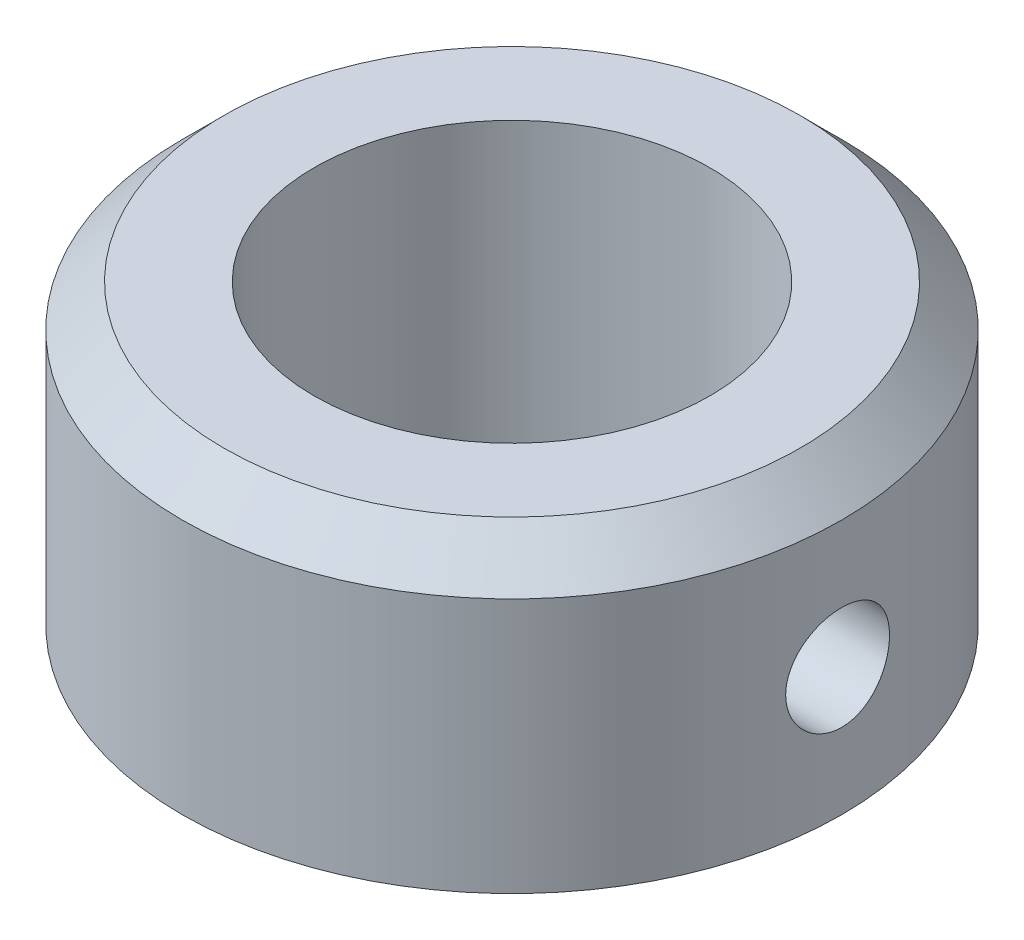
ISO-10303-21;
HEADER;
FILE_DESCRIPTION(('STEP AP214'),'2;1');
FILE_NAME('part.step','',(''),(''),'','','');
FILE_SCHEMA(('AUTOMOTIVE_DESIGN { 1 0 10303 214 1 1 1 1 }'));
ENDSEC;
DATA;
#1=APPLICATION_CONTEXT('core data for automotive mechanical design processes');
#2=APPLICATION_PROTOCOL_DEFINITION('international standard','automotive_design',2000,#1);
#3=PRODUCT_CONTEXT('',#1,'mechanical');
#4=PRODUCT('Part','Part','',(#3));
#5=PRODUCT_RELATED_PRODUCT_CATEGORY('part','',(#4));
#6=PRODUCT_DEFINITION_FORMATION('','',#4);
#7=PRODUCT_DEFINITION_CONTEXT('part definition',#1,'design');
#8=PRODUCT_DEFINITION('design','',#6,#7);
#9=PRODUCT_DEFINITION_SHAPE('','',#8);
#10=(LENGTH_UNIT() NAMED_UNIT(*) SI_UNIT(.MILLI.,.METRE.));
#11=(NAMED_UNIT(*) PLANE_ANGLE_UNIT() SI_UNIT($,.RADIAN.));
#12=(NAMED_UNIT(*) SI_UNIT($,.STERADIAN.) SOLID_ANGLE_UNIT());
#13=UNCERTAINTY_MEASURE_WITH_UNIT(LENGTH_MEASURE(1.E-05),#10,'distance_accuracy_value','');
#14=(GEOMETRIC_REPRESENTATION_CONTEXT(3) GLOBAL_UNCERTAINTY_ASSIGNED_CONTEXT((#13)) GLOBAL_UNIT_ASSIGNED_CONTEXT((#10,
#11,#12)) REPRESENTATION_CONTEXT('',''));
#15=CARTESIAN_POINT('',(0.,0.,0.));
#16=DIRECTION('',(0.,0.,1.));
#17=DIRECTION('',(1.,0.,0.));
#18=AXIS2_PLACEMENT_3D('',#15,#16,#17);
#19=CARTESIAN_POINT('',(0.,14.2875,0.));
#20=DIRECTION('',(0.,-1.,0.));
#21=DIRECTION('',(0.,0.,-1.));
#22=AXIS2_PLACEMENT_3D('',#19,#20,#21);
#23=CYLINDRICAL_SURFACE('',#22,15.875);
#24=CARTESIAN_POINT('',(0.,0.,0.));
#25=DIRECTION('',(0.,1.,0.));
#26=DIRECTION('',(0.,0.,1.));
#27=AXIS2_PLACEMENT_3D('',#24,#25,#26);
#28=CIRCLE('',#27,15.875);
#29=CARTESIAN_POINT('',(0.,0.,15.875));
#30=VERTEX_POINT('',#29);
#31=EDGE_CURVE('E49',#30,#30,#28,.T.);
#32=ORIENTED_EDGE('',*,*,#31,.T.);
#33=EDGE_LOOP('',(#32));
#34=FACE_BOUND('',#33,.T.);
#35=CARTESIAN_POINT('',(0.,12.2875,0.));
#36=DIRECTION('',(0.,1.,0.));
#37=DIRECTION('',(0.,0.,1.));
#38=AXIS2_PLACEMENT_3D('',#35,#36,#37);
#39=CIRCLE('',#38,15.875);
#40=CARTESIAN_POINT('',(0.,12.2875,15.875));
#41=VERTEX_POINT('',#40);
#42=EDGE_CURVE('E11',#41,#41,#39,.F.);
#43=ORIENTED_EDGE('',*,*,#42,.T.);
#44=EDGE_LOOP('',(#43));
#45=FACE_BOUND('',#44,.T.);
#46=CARTESIAN_POINT('',(15.875,3.64374999999999,0.));
#47=CARTESIAN_POINT('',(15.8749976905285,3.64375568619766,-0.139500830185539));
#48=CARTESIAN_POINT('',(15.8731419947801,3.65546571914622,-0.27908051086493));
#49=CARTESIAN_POINT('',(15.8659178948552,3.70198127543063,-0.554332602169205));
#50=CARTESIAN_POINT('',(15.8605461533575,3.73680874155772,-0.690001172630402));
#51=CARTESIAN_POINT('',(15.8468931231182,3.8284878014384,-0.953408250254179));
#52=CARTESIAN_POINT('',(15.838614113172,3.88532214917516,-1.08115287640878));
#53=CARTESIAN_POINT('',(15.8200593959887,4.01935816896407,-1.32527427507236));
#54=CARTESIAN_POINT('',(15.8097839446581,4.0965572310916,-1.44165250167252));
#55=CARTESIAN_POINT('',(15.7882789181249,4.26983619062099,-1.66075371320891));
#56=CARTESIAN_POINT('',(15.7770426276349,4.36605639917065,-1.76336508403649));
#57=CARTESIAN_POINT('',(15.7549343730742,4.57434432602156,-1.95105633049785));
#58=CARTESIAN_POINT('',(15.7440624308607,4.68641299297455,-2.03613515592474));
#59=CARTESIAN_POINT('',(15.7238487495485,4.92397396997373,-2.18678638582598));
#60=CARTESIAN_POINT('',(15.7145156893653,5.04953623139938,-2.25224975018839));
#61=CARTESIAN_POINT('',(15.6985288603171,5.31004575806093,-2.36111476445918));
#62=CARTESIAN_POINT('',(15.6918749302862,5.44499245819325,-2.40451774147437));
#63=CARTESIAN_POINT('',(15.6820661459361,5.71926219228117,-2.46768106832768));
#64=CARTESIAN_POINT('',(15.6788829200043,5.85854002018507,-2.48763322567596));
#65=CARTESIAN_POINT('',(15.6762899681021,6.13850035775269,-2.50392296535857));
#66=CARTESIAN_POINT('',(15.6768800035713,6.27918277805104,-2.50026204060486));
#67=CARTESIAN_POINT('',(15.6817409808078,6.55659768988391,-2.46958605918015));
#68=CARTESIAN_POINT('',(15.6859781251668,6.69335457016474,-2.44278542892775));
#69=CARTESIAN_POINT('',(15.6976030586647,6.96040597994823,-2.36692683994249));
#70=CARTESIAN_POINT('',(15.7049909452313,7.09070030947596,-2.3178681929413));
#71=CARTESIAN_POINT('',(15.7221219088789,7.34177586868773,-2.19866560666104));
#72=CARTESIAN_POINT('',(15.7318750083601,7.46251363585546,-2.1284316220382));
#73=CARTESIAN_POINT('',(15.7526303533456,7.69057144600376,-1.96893608650968));
#74=CARTESIAN_POINT('',(15.7636326890424,7.79789051900474,-1.87967316134396));
#75=CARTESIAN_POINT('',(15.7857957932742,7.99730661872632,-1.68348037331111));
#76=CARTESIAN_POINT('',(15.7969569697721,8.08922248190791,-1.57636631847325));
#77=CARTESIAN_POINT('',(15.8180675813961,8.25380182007237,-1.34813750885387));
#78=CARTESIAN_POINT('',(15.8280170101873,8.32646519440781,-1.22702268088441));
#79=CARTESIAN_POINT('',(15.8455950668554,8.45048934185267,-0.974067497564928));
#80=CARTESIAN_POINT('',(15.8532220747265,8.50183525398975,-0.842219736330852));
#81=CARTESIAN_POINT('',(15.8652826395636,8.58160483169139,-0.571625621220902));
#82=CARTESIAN_POINT('',(15.8697164347249,8.61003020701512,-0.432879782727474));
#83=CARTESIAN_POINT('',(15.8748592486748,8.64290887563517,-0.153990644078612));
#84=CARTESIAN_POINT('',(15.8756069401627,8.64761107255733,-0.0138773750128064));
#85=CARTESIAN_POINT('',(15.8733988569315,8.63357184728466,0.265135999056329));
#86=CARTESIAN_POINT('',(15.8704432089591,8.61483122741859,0.404036145414867));
#87=CARTESIAN_POINT('',(15.861184470036,8.55464534978266,0.675919980113211));
#88=CARTESIAN_POINT('',(15.8548993895314,8.51332221365492,0.808931368155592));
#89=CARTESIAN_POINT('',(15.8396839683055,8.40927371003808,1.06613817146967));
#90=CARTESIAN_POINT('',(15.8307534925415,8.34654724992335,1.19033313627767));
#91=CARTESIAN_POINT('',(15.8111428817046,8.20089479134012,1.42747033732642));
#92=CARTESIAN_POINT('',(15.8004493830625,8.1178119535511,1.5403151151242));
#93=CARTESIAN_POINT('',(15.7785422557241,7.93402237169006,1.75054907048365));
#94=CARTESIAN_POINT('',(15.7673285935611,7.8333144924916,1.84793725180501));
#95=CARTESIAN_POINT('',(15.7455212987284,7.61602182136812,2.02540661809191));
#96=CARTESIAN_POINT('',(15.7349343180859,7.49929950898468,2.1053203673828));
#97=CARTESIAN_POINT('',(15.7156996825081,7.25394156017173,2.24440617344564));
#98=CARTESIAN_POINT('',(15.7070519710765,7.12530627095504,2.3035788344921));
#99=CARTESIAN_POINT('',(15.692723937201,6.86025953567076,2.39924721152534));
#100=CARTESIAN_POINT('',(15.6870323710349,6.72387977575668,2.43582895415268));
#101=CARTESIAN_POINT('',(15.6792318846374,6.44681516890138,2.48554958140439));
#102=CARTESIAN_POINT('',(15.6771226893067,6.3061306533778,2.49869026612996));
#103=CARTESIAN_POINT('',(15.676736726904,6.0261202257018,2.50110970594388));
#104=CARTESIAN_POINT('',(15.6784176584198,5.88679657673935,2.4906518422088));
#105=CARTESIAN_POINT('',(15.6853302792804,5.61191659438835,2.4467376845153));
#106=CARTESIAN_POINT('',(15.690561960518,5.47636025239893,2.41328144306746));
#107=CARTESIAN_POINT('',(15.7039712491697,5.2129484462654,2.32441679309038));
#108=CARTESIAN_POINT('',(15.7121461345813,5.08508599358907,2.26902866340948));
#109=CARTESIAN_POINT('',(15.7305237299556,4.8404258214591,2.13789904354915));
#110=CARTESIAN_POINT('',(15.7407265226245,4.72362855357558,2.06215672319887));
#111=CARTESIAN_POINT('',(15.7621455234337,4.50307924052417,1.89151919110473));
#112=CARTESIAN_POINT('',(15.7733713279086,4.39947860811159,1.79642945775363));
#113=CARTESIAN_POINT('',(15.7954929431067,4.20961258205631,1.59020731461215));
#114=CARTESIAN_POINT('',(15.8063886767938,4.12335120919593,1.47907119408493));
#115=CARTESIAN_POINT('',(15.8266990047721,3.97013678634375,1.24310883334057));
#116=CARTESIAN_POINT('',(15.8361041509665,3.90330482424304,1.11820315980724));
#117=CARTESIAN_POINT('',(15.852281357129,3.79167124789795,0.858846165525345));
#118=CARTESIAN_POINT('',(15.8590560972272,3.74684719732645,0.724404726913459));
#119=CARTESIAN_POINT('',(15.8676922722872,3.6904796876912,0.49116214316524));
#120=CARTESIAN_POINT('',(15.8704183473439,3.67298339075226,0.393788645173249));
#121=CARTESIAN_POINT('',(15.8740730163387,3.64961661643718,0.197623276756319));
#122=CARTESIAN_POINT('',(15.8750016361792,3.64374597152913,0.0988314267912595));
#123=CARTESIAN_POINT('',(15.875,3.64374999999999,0.));
#124=B_SPLINE_CURVE_WITH_KNOTS('',3,(#46,#47,#48,#49,#50,#51,#52,#53,#54,#55,#56,#57,#58,#59,
#60,#61,#62,#63,#64,#65,#66,#67,#68,#69,#70,#71,#72,#73,#74,#75,#76,#77,#78,#79,#80,#81,#82,#83,
#84,#85,#86,#87,#88,#89,#90,#91,#92,#93,#94,#95,#96,#97,#98,#99,#100,#101,#102,#103,#104,#105,
#106,#107,#108,#109,#110,#111,#112,#113,#114,#115,#116,#117,#118,#119,#120,#121,#122,#123),
.UNSPECIFIED.,.T.,.F.,(4,2,2,2,2,2,2,2,2,2,2,2,2,2,2,2,2,2,2,2,2,2,2,2,2,2,2,2,2,2,2,2,2,2,2,2,
2,2,4),(0.,0.418141299505619,0.836680062378933,1.25489149284709,1.67304935170822,
2.09441534800902,2.51580657697912,2.9394985756162,3.36316508281016,3.78334170110814,
4.20349175444764,4.61978972807952,5.03610057546584,5.45420731538406,5.8723442609858,
6.29509819735069,6.71785434372836,7.14090471184343,7.56392351956437,7.98249464572574,
8.40105144671147,8.81736685958792,9.23370352827303,9.65335478855145,10.0730330860802,
10.4965717289606,10.9200980313658,11.3420014287822,11.763872425719,12.1810582772812,
12.5982431763157,13.0150432317042,13.4318602893795,13.8530958778462,14.2744290337812,
14.6983343361412,15.1218065792834,15.418049237561,15.7142876267916),.UNSPECIFIED.);
#125=CARTESIAN_POINT('',(15.875,3.64374999999999,0.));
#126=VERTEX_POINT('',#125);
#127=EDGE_CURVE('E58',#126,#126,#124,.T.);
#128=ORIENTED_EDGE('',*,*,#127,.F.);
#129=EDGE_LOOP('',(#128));
#130=FACE_BOUND('',#129,.T.);
#131=ADVANCED_FACE('F32',(#34,#45,#130),#23,.T.);
#132=CARTESIAN_POINT('',(0.,14.2875,0.));
#133=DIRECTION('',(0.,-1.,0.));
#134=DIRECTION('',(0.,0.,-1.));
#135=AXIS2_PLACEMENT_3D('',#132,#133,#134);
#136=CYLINDRICAL_SURFACE('',#135,9.525);
#137=CARTESIAN_POINT('',(0.,0.,0.));
#138=DIRECTION('',(0.,1.,0.));
#139=DIRECTION('',(0.,0.,1.));
#140=AXIS2_PLACEMENT_3D('',#137,#138,#139);
#141=CIRCLE('',#140,9.525);
#142=CARTESIAN_POINT('',(0.,0.,9.525));
#143=VERTEX_POINT('',#142);
#144=EDGE_CURVE('E55',#143,#143,#141,.T.);
#145=ORIENTED_EDGE('',*,*,#144,.F.);
#146=EDGE_LOOP('',(#145));
#147=FACE_BOUND('',#146,.T.);
#148=CARTESIAN_POINT('',(0.,14.2875,0.));
#149=DIRECTION('',(0.,1.,0.));
#150=DIRECTION('',(0.,0.,1.));
#151=AXIS2_PLACEMENT_3D('',#148,#149,#150);
#152=CIRCLE('',#151,9.525);
#153=CARTESIAN_POINT('',(0.,14.2875,9.525));
#154=VERTEX_POINT('',#153);
#155=EDGE_CURVE('E54',#154,#154,#152,.T.);
#156=ORIENTED_EDGE('',*,*,#155,.T.);
#157=EDGE_LOOP('',(#156));
#158=FACE_BOUND('',#157,.T.);
#159=CARTESIAN_POINT('',(9.19106223458421,6.14374999999999,2.5));
#160=CARTESIAN_POINT('',(9.19106469671783,6.00594461933303,2.49999651630335));
#161=CARTESIAN_POINT('',(9.19419536524864,5.86810195062341,2.48856698911158));
#162=CARTESIAN_POINT('',(9.20634374047816,5.59639171921487,2.44323395975473));
#163=CARTESIAN_POINT('',(9.21536452143121,5.4625262705328,2.40931872137328));
#164=CARTESIAN_POINT('',(9.2382026550406,5.2027402318986,2.32020118152029));
#165=CARTESIAN_POINT('',(9.25201340372133,5.07680898400162,2.26502817678528));
#166=CARTESIAN_POINT('',(9.28286698075181,4.83597190264158,2.13505240585555));
#167=CARTESIAN_POINT('',(9.29991003121361,4.72106682767478,2.06024829054647));
#168=CARTESIAN_POINT('',(9.33577063144502,4.50275891310907,1.89119561005043));
#169=CARTESIAN_POINT('',(9.3546188535647,4.39966283821349,1.79655732671428));
#170=CARTESIAN_POINT('',(9.3917009954108,4.21060887398004,1.59136122600481));
#171=CARTESIAN_POINT('',(9.40993485294923,4.12465271529567,1.4808018029795));
#172=CARTESIAN_POINT('',(9.44407532289643,3.97104557772516,1.24478124331787));
#173=CARTESIAN_POINT('',(9.45994152894907,3.90369864204288,1.11911587703889));
#174=CARTESIAN_POINT('',(9.48720758730729,3.79120300590704,0.857760542880182));
#175=CARTESIAN_POINT('',(9.49860816828216,3.74605068358582,0.722072214775204));
#176=CARTESIAN_POINT('',(9.51544156977354,3.68021617052461,0.447723648627483));
#177=CARTESIAN_POINT('',(9.52100140611609,3.6590123778821,0.309196507162028));
#178=CARTESIAN_POINT('',(9.52597058957104,3.64003674009341,0.0304471293071426));
#179=CARTESIAN_POINT('',(9.52538093515139,3.64226109101489,-0.109774828209029));
#180=CARTESIAN_POINT('',(9.51821102208942,3.66970926613428,-0.384306232903464));
#181=CARTESIAN_POINT('',(9.51177751894229,3.69436968175229,-0.518676426459475));
#182=CARTESIAN_POINT('',(9.49381536195328,3.76508094490616,-0.781300207566575));
#183=CARTESIAN_POINT('',(9.48228642225872,3.81113299251447,-0.909553451511083));
#184=CARTESIAN_POINT('',(9.45520936119211,3.92375824014636,-1.15775281714907));
#185=CARTESIAN_POINT('',(9.43962329369205,3.99052639410935,-1.27760616489887));
#186=CARTESIAN_POINT('',(9.40611425532938,4.14253937737374,-1.50460091650506));
#187=CARTESIAN_POINT('',(9.38819084162893,4.2277877099954,-1.61173990411027));
#188=CARTESIAN_POINT('',(9.35132281482883,4.41733965210153,-1.81362691900899));
#189=CARTESIAN_POINT('',(9.33236368507222,4.52213491604779,-1.90791120855082));
#190=CARTESIAN_POINT('',(9.2960441466663,4.74624628227541,-2.07767804040785));
#191=CARTESIAN_POINT('',(9.27868382934781,4.86556321319218,-2.15315950904694));
#192=CARTESIAN_POINT('',(9.24747084091809,5.1163116938337,-2.28351644622864));
#193=CARTESIAN_POINT('',(9.23363914174682,5.24780962061492,-2.33826960831188));
#194=CARTESIAN_POINT('',(9.21131205881438,5.51859710655732,-2.42474154648091));
#195=CARTESIAN_POINT('',(9.20281539912948,5.6578847940405,-2.45646583041804));
#196=CARTESIAN_POINT('',(9.19239121862609,5.93597029004676,-2.49518779718754));
#197=CARTESIAN_POINT('',(9.19028039169482,6.07466523057456,-2.50287567086191));
#198=CARTESIAN_POINT('',(9.19236601037381,6.35135821287837,-2.49520508643));
#199=CARTESIAN_POINT('',(9.19656180844587,6.4893563247422,-2.47984899438321));
#200=CARTESIAN_POINT('',(9.21061121366575,6.75810409889309,-2.42713401203908));
#201=CARTESIAN_POINT('',(9.22035891930024,6.88894055229572,-2.39018663716803));
#202=CARTESIAN_POINT('',(9.24431111095941,7.14256039624038,-2.29579892544996));
#203=CARTESIAN_POINT('',(9.25851616537598,7.26534275732567,-2.23835597492143));
#204=CARTESIAN_POINT('',(9.2901612358676,7.50226617550612,-2.10319536668792));
#205=CARTESIAN_POINT('',(9.30766391896881,7.61616637440571,-2.0250705152844));
#206=CARTESIAN_POINT('',(9.34378308974656,7.82949377411581,-1.85127112066926));
#207=CARTESIAN_POINT('',(9.36239977959191,7.92891833659428,-1.75559338542987));
#208=CARTESIAN_POINT('',(9.39927786841089,8.11331937337981,-1.54621811097832));
#209=CARTESIAN_POINT('',(9.41751487521746,8.19781552315954,-1.43209240369362));
#210=CARTESIAN_POINT('',(9.45104474641045,8.34644876314126,-1.1908749638829));
#211=CARTESIAN_POINT('',(9.46633776713962,8.41058693458745,-1.06378392044015));
#212=CARTESIAN_POINT('',(9.49215832795568,8.51610201903841,-0.801136204232729));
#213=CARTESIAN_POINT('',(9.50272107587817,8.55764760505374,-0.665650921019941));
#214=CARTESIAN_POINT('',(9.51804571346392,8.61729234308272,-0.38930441335033));
#215=CARTESIAN_POINT('',(9.52280884552231,8.6353965167742,-0.248444346951342));
#216=CARTESIAN_POINT('',(9.52594095151323,8.64733812723273,0.0301595122355567));
#217=CARTESIAN_POINT('',(9.52449586601004,8.64188121056917,0.167871404466952));
#218=CARTESIAN_POINT('',(9.51579230125348,8.60848827109106,0.44034443559206));
#219=CARTESIAN_POINT('',(9.50853402822096,8.58055304568667,0.575105678984813));
#220=CARTESIAN_POINT('',(9.48905447985021,8.50339035920003,0.837031488405952));
#221=CARTESIAN_POINT('',(9.47686567932714,8.45430208670446,0.964239633541226));
#222=CARTESIAN_POINT('',(9.4488018447247,8.33635138880815,1.20868668315976));
#223=CARTESIAN_POINT('',(9.43292630649389,8.26748625867049,1.32592422119111));
#224=CARTESIAN_POINT('',(9.39867611913775,8.10984907998123,1.55040317248687));
#225=CARTESIAN_POINT('',(9.38024725825729,8.02060632884076,1.65730575368075));
#226=CARTESIAN_POINT('',(9.34319295861769,7.82564535475627,1.85485689302006));
#227=CARTESIAN_POINT('',(9.32456746989626,7.71992284562675,1.94550120935968));
#228=CARTESIAN_POINT('',(9.28877718764883,7.49231715162915,2.10985382999903));
#229=CARTESIAN_POINT('',(9.27165154261029,7.37013986007461,2.18316410006038));
#230=CARTESIAN_POINT('',(9.24134569862471,7.11476017796992,2.30809776105784));
#231=CARTESIAN_POINT('',(9.22816284486072,6.98156528344162,2.35973575417369));
#232=CARTESIAN_POINT('',(9.20912537607401,6.73128568440578,2.43285817581199));
#233=CARTESIAN_POINT('',(9.20240549628642,6.61531618602453,2.4579783582096));
#234=CARTESIAN_POINT('',(9.19337310015429,6.38082347563426,2.4915498850249));
#235=CARTESIAN_POINT('',(9.19106011647199,6.2623005357581,2.50000299693744));
#236=CARTESIAN_POINT('',(9.19106223458421,6.14374999999999,2.5));
#237=B_SPLINE_CURVE_WITH_KNOTS('',3,(#159,#160,#161,#162,#163,#164,#165,#166,#167,#168,#169,
#170,#171,#172,#173,#174,#175,#176,#177,#178,#179,#180,#181,#182,#183,#184,#185,#186,#187,#188,
#189,#190,#191,#192,#193,#194,#195,#196,#197,#198,#199,#200,#201,#202,#203,#204,#205,#206,#207,
#208,#209,#210,#211,#212,#213,#214,#215,#216,#217,#218,#219,#220,#221,#222,#223,#224,#225,#226,
#227,#228,#229,#230,#231,#232,#233,#234,#235,#236),.UNSPECIFIED.,.T.,.F.,(4,2,2,2,2,2,2,2,2,2,2,
2,2,2,2,2,2,2,2,2,2,2,2,2,2,2,2,2,2,2,2,2,2,2,2,2,2,2,4),(0.,0.412980364300905,
0.826176449889437,1.23880510778357,1.6514621303029,2.07315025475375,2.49488093640762,
2.92314164454474,3.3513324429721,3.77000562874106,4.18861083729642,4.59698582695746,
5.00538372925883,5.417747914411,5.83019034064113,6.25490912606284,6.67965215816201,
7.10686369143113,7.53397301418161,7.94869990764462,8.36338422157175,8.77041142636264,
9.17749055552712,9.59327253122648,10.0091301928111,10.436586743212,10.8640205869238,
11.2882178596807,11.7123242447968,12.1238183210893,12.5352978004165,12.9441100967508,
13.3529783300157,13.7724690121704,14.1920689813797,14.6205291513118,15.0487001713948,
15.4040145720673,15.7592912906431),.UNSPECIFIED.);
#238=CARTESIAN_POINT('',(9.19106223458421,6.14374999999999,2.5));
#239=VERTEX_POINT('',#238);
#240=EDGE_CURVE('E36',#239,#239,#237,.T.);
#241=ORIENTED_EDGE('',*,*,#240,.T.);
#242=EDGE_LOOP('',(#241));
#243=FACE_BOUND('',#242,.T.);
#244=ADVANCED_FACE('F71',(#147,#158,#243),#136,.F.);
#245=CARTESIAN_POINT('',(0.,14.2875,0.));
#246=DIRECTION('',(0.,1.,0.));
#247=DIRECTION('',(0.,0.,1.));
#248=AXIS2_PLACEMENT_3D('',#245,#246,#247);
#249=PLANE('',#248);
#250=CARTESIAN_POINT('',(0.,14.2875,0.));
#251=DIRECTION('',(0.,1.,0.));
#252=DIRECTION('',(0.,0.,1.));
#253=AXIS2_PLACEMENT_3D('',#250,#251,#252);
#254=CIRCLE('',#253,13.875);
#255=CARTESIAN_POINT('',(0.,14.2875,13.875));
#256=VERTEX_POINT('',#255);
#257=EDGE_CURVE('E45',#256,#256,#254,.T.);
#258=ORIENTED_EDGE('',*,*,#257,.T.);
#259=EDGE_LOOP('',(#258));
#260=FACE_BOUND('',#259,.T.);
#261=ORIENTED_EDGE('',*,*,#155,.F.);
#262=EDGE_LOOP('',(#261));
#263=FACE_BOUND('',#262,.T.);
#264=ADVANCED_FACE('F76',(#260,#263),#249,.T.);
#265=CARTESIAN_POINT('',(0.,0.,0.));
#266=DIRECTION('',(0.,1.,0.));
#267=DIRECTION('',(0.,0.,1.));
#268=AXIS2_PLACEMENT_3D('',#265,#266,#267);
#269=PLANE('',#268);
#270=ORIENTED_EDGE('',*,*,#31,.F.);
#271=EDGE_LOOP('',(#270));
#272=FACE_BOUND('',#271,.T.);
#273=ORIENTED_EDGE('',*,*,#144,.T.);
#274=EDGE_LOOP('',(#273));
#275=FACE_BOUND('',#274,.T.);
#276=ADVANCED_FACE('F79',(#272,#275),#269,.F.);
#277=CARTESIAN_POINT('',(0.,14.2875,0.));
#278=DIRECTION('',(0.,-1.,0.));
#279=DIRECTION('',(0.,0.,-1.));
#280=AXIS2_PLACEMENT_3D('',#277,#278,#279);
#281=CONICAL_SURFACE('',#280,13.875,0.785398163397447);
#282=ORIENTED_EDGE('',*,*,#42,.F.);
#283=EDGE_LOOP('',(#282));
#284=FACE_BOUND('',#283,.T.);
#285=ORIENTED_EDGE('',*,*,#257,.F.);
#286=EDGE_LOOP('',(#285));
#287=FACE_BOUND('',#286,.T.);
#288=ADVANCED_FACE('F34',(#284,#287),#281,.T.);
#289=CARTESIAN_POINT('',(15.875,6.14374999999999,0.));
#290=DIRECTION('',(-1.,0.,0.));
#291=DIRECTION('',(0.,0.,1.));
#292=AXIS2_PLACEMENT_3D('',#289,#290,#291);
#293=CYLINDRICAL_SURFACE('',#292,2.5);
#294=ORIENTED_EDGE('',*,*,#240,.F.);
#295=EDGE_LOOP('',(#294));
#296=FACE_BOUND('',#295,.T.);
#297=ORIENTED_EDGE('',*,*,#127,.T.);
#298=EDGE_LOOP('',(#297));
#299=FACE_BOUND('',#298,.T.);
#300=ADVANCED_FACE('F67',(#296,#299),#293,.F.);
#301=CLOSED_SHELL('',(#131,#244,#264,#276,#288,#300));
#302=MANIFOLD_SOLID_BREP('B2',#301);
#303=ADVANCED_BREP_SHAPE_REPRESENTATION('',(#18,#302),#14);
#304=SHAPE_DEFINITION_REPRESENTATION(#9,#303);
ENDSEC;
END-ISO-10303-21;
